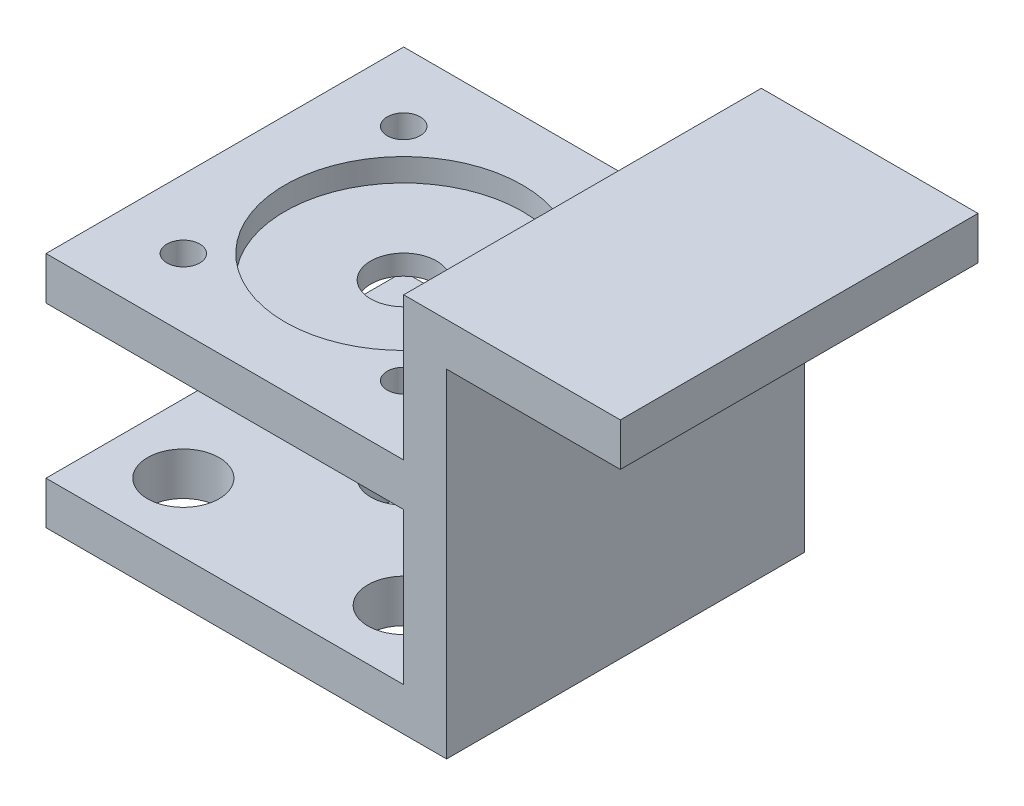
ISO-10303-21;
HEADER;
FILE_DESCRIPTION(('STEP AP214'),'2;1');
FILE_NAME('part.step','',(''),(''),'','','');
FILE_SCHEMA(('AUTOMOTIVE_DESIGN { 1 0 10303 214 1 1 1 1 }'));
ENDSEC;
DATA;
#1=APPLICATION_CONTEXT('core data for automotive mechanical design processes');
#2=APPLICATION_PROTOCOL_DEFINITION('international standard','automotive_design',2000,#1);
#3=PRODUCT_CONTEXT('',#1,'mechanical');
#4=PRODUCT('Part','Part','',(#3));
#5=PRODUCT_RELATED_PRODUCT_CATEGORY('part','',(#4));
#6=PRODUCT_DEFINITION_FORMATION('','',#4);
#7=PRODUCT_DEFINITION_CONTEXT('part definition',#1,'design');
#8=PRODUCT_DEFINITION('design','',#6,#7);
#9=PRODUCT_DEFINITION_SHAPE('','',#8);
#10=(LENGTH_UNIT() NAMED_UNIT(*) SI_UNIT(.MILLI.,.METRE.));
#11=(NAMED_UNIT(*) PLANE_ANGLE_UNIT() SI_UNIT($,.RADIAN.));
#12=(NAMED_UNIT(*) SI_UNIT($,.STERADIAN.) SOLID_ANGLE_UNIT());
#13=UNCERTAINTY_MEASURE_WITH_UNIT(LENGTH_MEASURE(1.E-05),#10,'distance_accuracy_value','');
#14=(GEOMETRIC_REPRESENTATION_CONTEXT(3) GLOBAL_UNCERTAINTY_ASSIGNED_CONTEXT((#13)) GLOBAL_UNIT_ASSIGNED_CONTEXT((#10,
#11,#12)) REPRESENTATION_CONTEXT('',''));
#15=CARTESIAN_POINT('',(0.,0.,0.));
#16=DIRECTION('',(0.,0.,1.));
#17=DIRECTION('',(1.,0.,0.));
#18=AXIS2_PLACEMENT_3D('',#15,#16,#17);
#19=CARTESIAN_POINT('',(0.,3.,0.));
#20=DIRECTION('',(0.,-1.,0.));
#21=DIRECTION('',(0.,0.,-1.));
#22=AXIS2_PLACEMENT_3D('',#19,#20,#21);
#23=PLANE('',#22);
#24=CARTESIAN_POINT('',(0.,3.,0.));
#25=DIRECTION('',(0.,1.,0.));
#26=DIRECTION('',(0.,0.,1.));
#27=AXIS2_PLACEMENT_3D('',#24,#25,#26);
#28=CIRCLE('',#27,8.3);
#29=CARTESIAN_POINT('',(0.,3.,8.3));
#30=VERTEX_POINT('',#29);
#31=EDGE_CURVE('E184',#30,#30,#28,.T.);
#32=ORIENTED_EDGE('',*,*,#31,.F.);
#33=EDGE_LOOP('',(#32));
#34=FACE_BOUND('',#33,.T.);
#35=CARTESIAN_POINT('',(7.7,3.,-7.7));
#36=DIRECTION('',(0.,1.,0.));
#37=DIRECTION('',(0.,0.,1.));
#38=AXIS2_PLACEMENT_3D('',#35,#36,#37);
#39=CIRCLE('',#38,1.15);
#40=CARTESIAN_POINT('',(7.7,3.,-6.55));
#41=VERTEX_POINT('',#40);
#42=EDGE_CURVE('E224',#41,#41,#39,.T.);
#43=ORIENTED_EDGE('',*,*,#42,.F.);
#44=EDGE_LOOP('',(#43));
#45=FACE_BOUND('',#44,.T.);
#46=CARTESIAN_POINT('',(7.7,3.,7.7));
#47=DIRECTION('',(0.,1.,0.));
#48=DIRECTION('',(0.,0.,1.));
#49=AXIS2_PLACEMENT_3D('',#46,#47,#48);
#50=CIRCLE('',#49,1.15);
#51=CARTESIAN_POINT('',(7.7,3.,8.85));
#52=VERTEX_POINT('',#51);
#53=EDGE_CURVE('E230',#52,#52,#50,.T.);
#54=ORIENTED_EDGE('',*,*,#53,.F.);
#55=EDGE_LOOP('',(#54));
#56=FACE_BOUND('',#55,.T.);
#57=CARTESIAN_POINT('',(-7.7,3.,7.7));
#58=DIRECTION('',(0.,1.,0.));
#59=DIRECTION('',(0.,0.,1.));
#60=AXIS2_PLACEMENT_3D('',#57,#58,#59);
#61=CIRCLE('',#60,1.15);
#62=CARTESIAN_POINT('',(-7.7,3.,8.85));
#63=VERTEX_POINT('',#62);
#64=EDGE_CURVE('E236',#63,#63,#61,.T.);
#65=ORIENTED_EDGE('',*,*,#64,.F.);
#66=EDGE_LOOP('',(#65));
#67=FACE_BOUND('',#66,.T.);
#68=CARTESIAN_POINT('',(-7.7,3.,-7.7));
#69=DIRECTION('',(0.,1.,0.));
#70=DIRECTION('',(0.,0.,1.));
#71=AXIS2_PLACEMENT_3D('',#68,#69,#70);
#72=CIRCLE('',#71,1.15);
#73=CARTESIAN_POINT('',(-7.7,3.,-6.55));
#74=VERTEX_POINT('',#73);
#75=EDGE_CURVE('E242',#74,#74,#72,.T.);
#76=ORIENTED_EDGE('',*,*,#75,.F.);
#77=EDGE_LOOP('',(#76));
#78=FACE_BOUND('',#77,.T.);
#79=DIRECTION('',(0.,0.,1.));
#80=VECTOR('',#79,1.);
#81=CARTESIAN_POINT('',(12.5,3.,-12.5));
#82=LINE('',#81,#80);
#83=CARTESIAN_POINT('',(12.5,3.,-12.5));
#84=VERTEX_POINT('',#83);
#85=CARTESIAN_POINT('',(12.5,3.,12.5));
#86=VERTEX_POINT('',#85);
#87=EDGE_CURVE('E62',#84,#86,#82,.T.);
#88=ORIENTED_EDGE('',*,*,#87,.F.);
#89=DIRECTION('',(-1.,0.,0.));
#90=VECTOR('',#89,1.);
#91=CARTESIAN_POINT('',(12.5,3.,-12.5));
#92=LINE('',#91,#90);
#93=CARTESIAN_POINT('',(-12.5,3.,-12.5));
#94=VERTEX_POINT('',#93);
#95=EDGE_CURVE('E254',#84,#94,#92,.T.);
#96=ORIENTED_EDGE('',*,*,#95,.T.);
#97=DIRECTION('',(0.,0.,1.));
#98=VECTOR('',#97,1.);
#99=CARTESIAN_POINT('',(-12.5,3.,-12.5));
#100=LINE('',#99,#98);
#101=CARTESIAN_POINT('',(-12.5,3.,12.5));
#102=VERTEX_POINT('',#101);
#103=EDGE_CURVE('E248',#94,#102,#100,.T.);
#104=ORIENTED_EDGE('',*,*,#103,.T.);
#105=DIRECTION('',(1.,0.,0.));
#106=VECTOR('',#105,1.);
#107=CARTESIAN_POINT('',(12.5,3.,12.5));
#108=LINE('',#107,#106);
#109=EDGE_CURVE('E251',#102,#86,#108,.T.);
#110=ORIENTED_EDGE('',*,*,#109,.T.);
#111=EDGE_LOOP('',(#88,#96,#104,#110));
#112=FACE_BOUND('',#111,.T.);
#113=ADVANCED_FACE('F39',(#34,#45,#56,#67,#78,#112),#23,.F.);
#114=CARTESIAN_POINT('',(0.,0.,0.));
#115=DIRECTION('',(0.,-1.,0.));
#116=DIRECTION('',(0.,0.,-1.));
#117=AXIS2_PLACEMENT_3D('',#114,#115,#116);
#118=PLANE('',#117);
#119=DIRECTION('',(0.,0.,-1.));
#120=VECTOR('',#119,1.);
#121=CARTESIAN_POINT('',(12.5,0.,12.5));
#122=LINE('',#121,#120);
#123=CARTESIAN_POINT('',(12.5,0.,12.5));
#124=VERTEX_POINT('',#123);
#125=CARTESIAN_POINT('',(12.5,0.,-12.5));
#126=VERTEX_POINT('',#125);
#127=EDGE_CURVE('E54',#124,#126,#122,.T.);
#128=ORIENTED_EDGE('',*,*,#127,.F.);
#129=DIRECTION('',(1.,0.,0.));
#130=VECTOR('',#129,1.);
#131=CARTESIAN_POINT('',(12.5,0.,12.5));
#132=LINE('',#131,#130);
#133=CARTESIAN_POINT('',(-12.5,0.,12.5));
#134=VERTEX_POINT('',#133);
#135=EDGE_CURVE('E259',#134,#124,#132,.T.);
#136=ORIENTED_EDGE('',*,*,#135,.F.);
#137=DIRECTION('',(0.,0.,1.));
#138=VECTOR('',#137,1.);
#139=CARTESIAN_POINT('',(-12.5,0.,-12.5));
#140=LINE('',#139,#138);
#141=CARTESIAN_POINT('',(-12.5,0.,-12.5));
#142=VERTEX_POINT('',#141);
#143=EDGE_CURVE('E245',#142,#134,#140,.T.);
#144=ORIENTED_EDGE('',*,*,#143,.F.);
#145=DIRECTION('',(-1.,0.,0.));
#146=VECTOR('',#145,1.);
#147=CARTESIAN_POINT('',(12.5,0.,-12.5));
#148=LINE('',#147,#146);
#149=EDGE_CURVE('E252',#126,#142,#148,.T.);
#150=ORIENTED_EDGE('',*,*,#149,.F.);
#151=EDGE_LOOP('',(#128,#136,#144,#150));
#152=FACE_BOUND('',#151,.T.);
#153=CARTESIAN_POINT('',(0.,0.,0.));
#154=DIRECTION('',(0.,1.,0.));
#155=DIRECTION('',(0.,0.,1.));
#156=AXIS2_PLACEMENT_3D('',#153,#154,#155);
#157=CIRCLE('',#156,2.3);
#158=CARTESIAN_POINT('',(0.,0.,2.3));
#159=VERTEX_POINT('',#158);
#160=EDGE_CURVE('E181',#159,#159,#157,.T.);
#161=ORIENTED_EDGE('',*,*,#160,.T.);
#162=EDGE_LOOP('',(#161));
#163=FACE_BOUND('',#162,.T.);
#164=CARTESIAN_POINT('',(7.7,0.,7.7));
#165=DIRECTION('',(0.,1.,0.));
#166=DIRECTION('',(0.,0.,1.));
#167=AXIS2_PLACEMENT_3D('',#164,#165,#166);
#168=CIRCLE('',#167,1.15);
#169=CARTESIAN_POINT('',(7.7,0.,8.85));
#170=VERTEX_POINT('',#169);
#171=EDGE_CURVE('E227',#170,#170,#168,.T.);
#172=ORIENTED_EDGE('',*,*,#171,.T.);
#173=EDGE_LOOP('',(#172));
#174=FACE_BOUND('',#173,.T.);
#175=CARTESIAN_POINT('',(-7.7,0.,-7.7));
#176=DIRECTION('',(0.,1.,0.));
#177=DIRECTION('',(0.,0.,1.));
#178=AXIS2_PLACEMENT_3D('',#175,#176,#177);
#179=CIRCLE('',#178,1.15);
#180=CARTESIAN_POINT('',(-7.7,0.,-6.55));
#181=VERTEX_POINT('',#180);
#182=EDGE_CURVE('E239',#181,#181,#179,.T.);
#183=ORIENTED_EDGE('',*,*,#182,.T.);
#184=EDGE_LOOP('',(#183));
#185=FACE_BOUND('',#184,.T.);
#186=CARTESIAN_POINT('',(-7.7,0.,7.7));
#187=DIRECTION('',(0.,1.,0.));
#188=DIRECTION('',(0.,0.,1.));
#189=AXIS2_PLACEMENT_3D('',#186,#187,#188);
#190=CIRCLE('',#189,1.15);
#191=CARTESIAN_POINT('',(-7.7,0.,8.85));
#192=VERTEX_POINT('',#191);
#193=EDGE_CURVE('E233',#192,#192,#190,.T.);
#194=ORIENTED_EDGE('',*,*,#193,.T.);
#195=EDGE_LOOP('',(#194));
#196=FACE_BOUND('',#195,.T.);
#197=CARTESIAN_POINT('',(7.7,0.,-7.7));
#198=DIRECTION('',(0.,1.,0.));
#199=DIRECTION('',(0.,0.,1.));
#200=AXIS2_PLACEMENT_3D('',#197,#198,#199);
#201=CIRCLE('',#200,1.15);
#202=CARTESIAN_POINT('',(7.7,0.,-6.55));
#203=VERTEX_POINT('',#202);
#204=EDGE_CURVE('E216',#203,#203,#201,.T.);
#205=ORIENTED_EDGE('',*,*,#204,.T.);
#206=EDGE_LOOP('',(#205));
#207=FACE_BOUND('',#206,.T.);
#208=ADVANCED_FACE('F299',(#152,#163,#174,#185,#196,#207),#118,.T.);
#209=CARTESIAN_POINT('',(-12.5,3.,-12.5));
#210=DIRECTION('',(1.,0.,0.));
#211=DIRECTION('',(0.,0.,-1.));
#212=AXIS2_PLACEMENT_3D('',#209,#210,#211);
#213=PLANE('',#212);
#214=ORIENTED_EDGE('',*,*,#143,.T.);
#215=DIRECTION('',(0.,-1.,0.));
#216=VECTOR('',#215,1.);
#217=CARTESIAN_POINT('',(-12.5,3.,12.5));
#218=LINE('',#217,#216);
#219=EDGE_CURVE('E12',#102,#134,#218,.T.);
#220=ORIENTED_EDGE('',*,*,#219,.F.);
#221=ORIENTED_EDGE('',*,*,#103,.F.);
#222=DIRECTION('',(0.,-1.,0.));
#223=VECTOR('',#222,1.);
#224=CARTESIAN_POINT('',(-12.5,3.,-12.5));
#225=LINE('',#224,#223);
#226=EDGE_CURVE('E256',#94,#142,#225,.T.);
#227=ORIENTED_EDGE('',*,*,#226,.T.);
#228=EDGE_LOOP('',(#214,#220,#221,#227));
#229=FACE_BOUND('',#228,.T.);
#230=ADVANCED_FACE('F41',(#229),#213,.F.);
#231=CARTESIAN_POINT('',(12.5,3.,12.5));
#232=DIRECTION('',(0.,0.,-1.));
#233=DIRECTION('',(-1.,0.,0.));
#234=AXIS2_PLACEMENT_3D('',#231,#232,#233);
#235=PLANE('',#234);
#236=ORIENTED_EDGE('',*,*,#135,.T.);
#237=DIRECTION('',(0.,1.,0.));
#238=VECTOR('',#237,1.);
#239=CARTESIAN_POINT('',(12.5,-10.6,12.5));
#240=LINE('',#239,#238);
#241=CARTESIAN_POINT('',(12.5,-10.6,12.5));
#242=VERTEX_POINT('',#241);
#243=EDGE_CURVE('E177',#242,#124,#240,.T.);
#244=ORIENTED_EDGE('',*,*,#243,.F.);
#245=DIRECTION('',(-1.,0.,0.));
#246=VECTOR('',#245,1.);
#247=CARTESIAN_POINT('',(15.5,-10.6,12.5));
#248=LINE('',#247,#246);
#249=CARTESIAN_POINT('',(-12.5,-10.6,12.5));
#250=VERTEX_POINT('',#249);
#251=EDGE_CURVE('E163',#242,#250,#248,.T.);
#252=ORIENTED_EDGE('',*,*,#251,.T.);
#253=DIRECTION('',(0.,1.,0.));
#254=VECTOR('',#253,1.);
#255=CARTESIAN_POINT('',(-12.5,-13.6,12.5));
#256=LINE('',#255,#254);
#257=CARTESIAN_POINT('',(-12.5,-13.6,12.5));
#258=VERTEX_POINT('',#257);
#259=EDGE_CURVE('E141',#258,#250,#256,.T.);
#260=ORIENTED_EDGE('',*,*,#259,.F.);
#261=DIRECTION('',(-1.,0.,0.));
#262=VECTOR('',#261,1.);
#263=CARTESIAN_POINT('',(15.5,-13.6,12.5));
#264=LINE('',#263,#262);
#265=CARTESIAN_POINT('',(15.5,-13.6,12.5));
#266=VERTEX_POINT('',#265);
#267=EDGE_CURVE('E138',#266,#258,#264,.T.);
#268=ORIENTED_EDGE('',*,*,#267,.F.);
#269=DIRECTION('',(0.,-1.,0.));
#270=VECTOR('',#269,1.);
#271=CARTESIAN_POINT('',(15.5,3.,12.5));
#272=LINE('',#271,#270);
#273=CARTESIAN_POINT('',(15.5,10.,12.5));
#274=VERTEX_POINT('',#273);
#275=EDGE_CURVE('E47',#274,#266,#272,.T.);
#276=ORIENTED_EDGE('',*,*,#275,.F.);
#277=DIRECTION('',(1.,0.,0.));
#278=VECTOR('',#277,1.);
#279=CARTESIAN_POINT('',(12.5,10.,12.5));
#280=LINE('',#279,#278);
#281=CARTESIAN_POINT('',(27.6439009661749,10.,12.5));
#282=VERTEX_POINT('',#281);
#283=EDGE_CURVE('E190',#274,#282,#280,.T.);
#284=ORIENTED_EDGE('',*,*,#283,.T.);
#285=DIRECTION('',(0.,-1.,0.));
#286=VECTOR('',#285,1.);
#287=CARTESIAN_POINT('',(27.6439009661749,13.,12.5));
#288=LINE('',#287,#286);
#289=CARTESIAN_POINT('',(27.6439009661749,13.,12.5));
#290=VERTEX_POINT('',#289);
#291=EDGE_CURVE('E212',#290,#282,#288,.T.);
#292=ORIENTED_EDGE('',*,*,#291,.F.);
#293=DIRECTION('',(1.,0.,0.));
#294=VECTOR('',#293,1.);
#295=CARTESIAN_POINT('',(12.5,13.,12.5));
#296=LINE('',#295,#294);
#297=CARTESIAN_POINT('',(12.5,13.,12.5));
#298=VERTEX_POINT('',#297);
#299=EDGE_CURVE('E196',#298,#290,#296,.T.);
#300=ORIENTED_EDGE('',*,*,#299,.F.);
#301=DIRECTION('',(0.,-1.,0.));
#302=VECTOR('',#301,1.);
#303=CARTESIAN_POINT('',(12.5,45.1793566240284,12.5));
#304=LINE('',#303,#302);
#305=EDGE_CURVE('E219',#298,#86,#304,.T.);
#306=ORIENTED_EDGE('',*,*,#305,.T.);
#307=ORIENTED_EDGE('',*,*,#109,.F.);
#308=ORIENTED_EDGE('',*,*,#219,.T.);
#309=EDGE_LOOP('',(#236,#244,#252,#260,#268,#276,#284,#292,#300,#306,#307,#308));
#310=FACE_BOUND('',#309,.T.);
#311=ADVANCED_FACE('F139',(#310),#235,.F.);
#312=CARTESIAN_POINT('',(15.5,3.,-12.5));
#313=DIRECTION('',(-1.,0.,0.));
#314=DIRECTION('',(0.,0.,1.));
#315=AXIS2_PLACEMENT_3D('',#312,#313,#314);
#316=PLANE('',#315);
#317=ORIENTED_EDGE('',*,*,#275,.T.);
#318=DIRECTION('',(0.,0.,1.));
#319=VECTOR('',#318,1.);
#320=CARTESIAN_POINT('',(15.5,-13.6,12.5));
#321=LINE('',#320,#319);
#322=CARTESIAN_POINT('',(15.5,-13.6,-12.5));
#323=VERTEX_POINT('',#322);
#324=EDGE_CURVE('E133',#323,#266,#321,.T.);
#325=ORIENTED_EDGE('',*,*,#324,.F.);
#326=DIRECTION('',(0.,-1.,0.));
#327=VECTOR('',#326,1.);
#328=CARTESIAN_POINT('',(15.5,3.,-12.5));
#329=LINE('',#328,#327);
#330=CARTESIAN_POINT('',(15.5,10.,-12.5));
#331=VERTEX_POINT('',#330);
#332=EDGE_CURVE('E136',#331,#323,#329,.T.);
#333=ORIENTED_EDGE('',*,*,#332,.F.);
#334=DIRECTION('',(0.,0.,1.));
#335=VECTOR('',#334,1.);
#336=CARTESIAN_POINT('',(15.5,10.,-12.5));
#337=LINE('',#336,#335);
#338=EDGE_CURVE('E134',#331,#274,#337,.T.);
#339=ORIENTED_EDGE('',*,*,#338,.T.);
#340=EDGE_LOOP('',(#317,#325,#333,#339));
#341=FACE_BOUND('',#340,.T.);
#342=ADVANCED_FACE('F130',(#341),#316,.F.);
#343=CARTESIAN_POINT('',(12.5,3.,-12.5));
#344=DIRECTION('',(0.,0.,1.));
#345=DIRECTION('',(1.,0.,0.));
#346=AXIS2_PLACEMENT_3D('',#343,#344,#345);
#347=PLANE('',#346);
#348=ORIENTED_EDGE('',*,*,#332,.T.);
#349=DIRECTION('',(1.,0.,0.));
#350=VECTOR('',#349,1.);
#351=CARTESIAN_POINT('',(15.5,-13.6,-12.5));
#352=LINE('',#351,#350);
#353=CARTESIAN_POINT('',(-12.5,-13.6,-12.5));
#354=VERTEX_POINT('',#353);
#355=EDGE_CURVE('E150',#354,#323,#352,.T.);
#356=ORIENTED_EDGE('',*,*,#355,.F.);
#357=DIRECTION('',(0.,1.,0.));
#358=VECTOR('',#357,1.);
#359=CARTESIAN_POINT('',(-12.5,-13.6,-12.5));
#360=LINE('',#359,#358);
#361=CARTESIAN_POINT('',(-12.5,-10.6,-12.5));
#362=VERTEX_POINT('',#361);
#363=EDGE_CURVE('E162',#354,#362,#360,.T.);
#364=ORIENTED_EDGE('',*,*,#363,.T.);
#365=DIRECTION('',(1.,0.,0.));
#366=VECTOR('',#365,1.);
#367=CARTESIAN_POINT('',(15.5,-10.6,-12.5));
#368=LINE('',#367,#366);
#369=CARTESIAN_POINT('',(12.5,-10.6,-12.5));
#370=VERTEX_POINT('',#369);
#371=EDGE_CURVE('E151',#362,#370,#368,.T.);
#372=ORIENTED_EDGE('',*,*,#371,.T.);
#373=DIRECTION('',(0.,1.,0.));
#374=VECTOR('',#373,1.);
#375=CARTESIAN_POINT('',(12.5,-10.6,-12.5));
#376=LINE('',#375,#374);
#377=EDGE_CURVE('E173',#370,#126,#376,.T.);
#378=ORIENTED_EDGE('',*,*,#377,.T.);
#379=ORIENTED_EDGE('',*,*,#149,.T.);
#380=ORIENTED_EDGE('',*,*,#226,.F.);
#381=ORIENTED_EDGE('',*,*,#95,.F.);
#382=DIRECTION('',(0.,-1.,0.));
#383=VECTOR('',#382,1.);
#384=CARTESIAN_POINT('',(12.5,45.1793566240284,-12.5));
#385=LINE('',#384,#383);
#386=CARTESIAN_POINT('',(12.5,13.,-12.5));
#387=VERTEX_POINT('',#386);
#388=EDGE_CURVE('E217',#387,#84,#385,.T.);
#389=ORIENTED_EDGE('',*,*,#388,.F.);
#390=DIRECTION('',(-1.,0.,0.));
#391=VECTOR('',#390,1.);
#392=CARTESIAN_POINT('',(12.5,13.,-12.5));
#393=LINE('',#392,#391);
#394=CARTESIAN_POINT('',(27.6439009661749,13.,-12.5));
#395=VERTEX_POINT('',#394);
#396=EDGE_CURVE('E201',#395,#387,#393,.T.);
#397=ORIENTED_EDGE('',*,*,#396,.F.);
#398=DIRECTION('',(0.,-1.,0.));
#399=VECTOR('',#398,1.);
#400=CARTESIAN_POINT('',(27.6439009661749,13.,-12.5));
#401=LINE('',#400,#399);
#402=CARTESIAN_POINT('',(27.6439009661749,10.,-12.5));
#403=VERTEX_POINT('',#402);
#404=EDGE_CURVE('E204',#395,#403,#401,.T.);
#405=ORIENTED_EDGE('',*,*,#404,.T.);
#406=DIRECTION('',(-1.,0.,0.));
#407=VECTOR('',#406,1.);
#408=CARTESIAN_POINT('',(12.5,10.,-12.5));
#409=LINE('',#408,#407);
#410=EDGE_CURVE('E197',#403,#331,#409,.T.);
#411=ORIENTED_EDGE('',*,*,#410,.T.);
#412=EDGE_LOOP('',(#348,#356,#364,#372,#378,#379,#380,#381,#389,#397,#405,#411));
#413=FACE_BOUND('',#412,.T.);
#414=ADVANCED_FACE('F265',(#413),#347,.F.);
#415=CARTESIAN_POINT('',(-7.7,3.,-7.7));
#416=DIRECTION('',(0.,-1.,0.));
#417=DIRECTION('',(0.,0.,-1.));
#418=AXIS2_PLACEMENT_3D('',#415,#416,#417);
#419=CYLINDRICAL_SURFACE('',#418,1.15);
#420=ORIENTED_EDGE('',*,*,#75,.T.);
#421=EDGE_LOOP('',(#420));
#422=FACE_BOUND('',#421,.T.);
#423=ORIENTED_EDGE('',*,*,#182,.F.);
#424=EDGE_LOOP('',(#423));
#425=FACE_BOUND('',#424,.T.);
#426=ADVANCED_FACE('F334',(#422,#425),#419,.F.);
#427=CARTESIAN_POINT('',(-7.7,3.,7.7));
#428=DIRECTION('',(0.,-1.,0.));
#429=DIRECTION('',(0.,0.,-1.));
#430=AXIS2_PLACEMENT_3D('',#427,#428,#429);
#431=CYLINDRICAL_SURFACE('',#430,1.15);
#432=ORIENTED_EDGE('',*,*,#64,.T.);
#433=EDGE_LOOP('',(#432));
#434=FACE_BOUND('',#433,.T.);
#435=ORIENTED_EDGE('',*,*,#193,.F.);
#436=EDGE_LOOP('',(#435));
#437=FACE_BOUND('',#436,.T.);
#438=ADVANCED_FACE('F323',(#434,#437),#431,.F.);
#439=CARTESIAN_POINT('',(7.7,3.,7.7));
#440=DIRECTION('',(0.,-1.,0.));
#441=DIRECTION('',(0.,0.,-1.));
#442=AXIS2_PLACEMENT_3D('',#439,#440,#441);
#443=CYLINDRICAL_SURFACE('',#442,1.15);
#444=ORIENTED_EDGE('',*,*,#53,.T.);
#445=EDGE_LOOP('',(#444));
#446=FACE_BOUND('',#445,.T.);
#447=ORIENTED_EDGE('',*,*,#171,.F.);
#448=EDGE_LOOP('',(#447));
#449=FACE_BOUND('',#448,.T.);
#450=ADVANCED_FACE('F315',(#446,#449),#443,.F.);
#451=CARTESIAN_POINT('',(7.7,3.,-7.7));
#452=DIRECTION('',(0.,-1.,0.));
#453=DIRECTION('',(0.,0.,-1.));
#454=AXIS2_PLACEMENT_3D('',#451,#452,#453);
#455=CYLINDRICAL_SURFACE('',#454,1.15);
#456=ORIENTED_EDGE('',*,*,#42,.T.);
#457=EDGE_LOOP('',(#456));
#458=FACE_BOUND('',#457,.T.);
#459=ORIENTED_EDGE('',*,*,#204,.F.);
#460=EDGE_LOOP('',(#459));
#461=FACE_BOUND('',#460,.T.);
#462=ADVANCED_FACE('F313',(#458,#461),#455,.F.);
#463=CARTESIAN_POINT('',(12.5,45.1793566240284,-12.5));
#464=DIRECTION('',(1.,0.,0.));
#465=DIRECTION('',(0.,0.,-1.));
#466=AXIS2_PLACEMENT_3D('',#463,#464,#465);
#467=PLANE('',#466);
#468=ORIENTED_EDGE('',*,*,#305,.F.);
#469=DIRECTION('',(0.,0.,1.));
#470=VECTOR('',#469,1.);
#471=CARTESIAN_POINT('',(12.5,13.,-12.5));
#472=LINE('',#471,#470);
#473=EDGE_CURVE('E193',#387,#298,#472,.T.);
#474=ORIENTED_EDGE('',*,*,#473,.F.);
#475=ORIENTED_EDGE('',*,*,#388,.T.);
#476=ORIENTED_EDGE('',*,*,#87,.T.);
#477=EDGE_LOOP('',(#468,#474,#475,#476));
#478=FACE_BOUND('',#477,.T.);
#479=ADVANCED_FACE('F281',(#478),#467,.F.);
#480=CARTESIAN_POINT('',(27.6439009661749,13.,-12.5));
#481=DIRECTION('',(-1.,0.,0.));
#482=DIRECTION('',(0.,0.,1.));
#483=AXIS2_PLACEMENT_3D('',#480,#481,#482);
#484=PLANE('',#483);
#485=DIRECTION('',(0.,0.,-1.));
#486=VECTOR('',#485,1.);
#487=CARTESIAN_POINT('',(27.6439009661749,10.,-12.5));
#488=LINE('',#487,#486);
#489=EDGE_CURVE('E206',#282,#403,#488,.T.);
#490=ORIENTED_EDGE('',*,*,#489,.T.);
#491=ORIENTED_EDGE('',*,*,#404,.F.);
#492=DIRECTION('',(0.,0.,-1.));
#493=VECTOR('',#492,1.);
#494=CARTESIAN_POINT('',(27.6439009661749,13.,-12.5));
#495=LINE('',#494,#493);
#496=EDGE_CURVE('E199',#290,#395,#495,.T.);
#497=ORIENTED_EDGE('',*,*,#496,.F.);
#498=ORIENTED_EDGE('',*,*,#291,.T.);
#499=EDGE_LOOP('',(#490,#491,#497,#498));
#500=FACE_BOUND('',#499,.T.);
#501=ADVANCED_FACE('F276',(#500),#484,.F.);
#502=CARTESIAN_POINT('',(0.,13.,0.));
#503=DIRECTION('',(0.,1.,0.));
#504=DIRECTION('',(0.,0.,1.));
#505=AXIS2_PLACEMENT_3D('',#502,#503,#504);
#506=PLANE('',#505);
#507=ORIENTED_EDGE('',*,*,#473,.T.);
#508=ORIENTED_EDGE('',*,*,#299,.T.);
#509=ORIENTED_EDGE('',*,*,#496,.T.);
#510=ORIENTED_EDGE('',*,*,#396,.T.);
#511=EDGE_LOOP('',(#507,#508,#509,#510));
#512=FACE_BOUND('',#511,.T.);
#513=ADVANCED_FACE('F278',(#512),#506,.T.);
#514=CARTESIAN_POINT('',(0.,10.,0.));
#515=DIRECTION('',(0.,1.,0.));
#516=DIRECTION('',(0.,0.,1.));
#517=AXIS2_PLACEMENT_3D('',#514,#515,#516);
#518=PLANE('',#517);
#519=ORIENTED_EDGE('',*,*,#338,.F.);
#520=ORIENTED_EDGE('',*,*,#410,.F.);
#521=ORIENTED_EDGE('',*,*,#489,.F.);
#522=ORIENTED_EDGE('',*,*,#283,.F.);
#523=EDGE_LOOP('',(#519,#520,#521,#522));
#524=FACE_BOUND('',#523,.T.);
#525=ADVANCED_FACE('F271',(#524),#518,.F.);
#526=CARTESIAN_POINT('',(0.,1.4,0.));
#527=DIRECTION('',(0.,1.,0.));
#528=DIRECTION('',(0.,0.,1.));
#529=AXIS2_PLACEMENT_3D('',#526,#527,#528);
#530=CYLINDRICAL_SURFACE('',#529,8.3);
#531=CARTESIAN_POINT('',(0.,1.4,0.));
#532=DIRECTION('',(0.,1.,0.));
#533=DIRECTION('',(0.,0.,1.));
#534=AXIS2_PLACEMENT_3D('',#531,#532,#533);
#535=CIRCLE('',#534,8.3);
#536=CARTESIAN_POINT('',(0.,1.4,8.3));
#537=VERTEX_POINT('',#536);
#538=EDGE_CURVE('E187',#537,#537,#535,.T.);
#539=ORIENTED_EDGE('',*,*,#538,.F.);
#540=EDGE_LOOP('',(#539));
#541=FACE_BOUND('',#540,.T.);
#542=ORIENTED_EDGE('',*,*,#31,.T.);
#543=EDGE_LOOP('',(#542));
#544=FACE_BOUND('',#543,.T.);
#545=ADVANCED_FACE('F495',(#541,#544),#530,.F.);
#546=CARTESIAN_POINT('',(0.,1.4,0.));
#547=DIRECTION('',(0.,1.,0.));
#548=DIRECTION('',(0.,0.,1.));
#549=AXIS2_PLACEMENT_3D('',#546,#547,#548);
#550=PLANE('',#549);
#551=CARTESIAN_POINT('',(0.,1.4,0.));
#552=DIRECTION('',(0.,1.,0.));
#553=DIRECTION('',(0.,0.,1.));
#554=AXIS2_PLACEMENT_3D('',#551,#552,#553);
#555=CIRCLE('',#554,2.3);
#556=CARTESIAN_POINT('',(0.,1.4,2.3));
#557=VERTEX_POINT('',#556);
#558=EDGE_CURVE('E180',#557,#557,#555,.T.);
#559=ORIENTED_EDGE('',*,*,#558,.F.);
#560=EDGE_LOOP('',(#559));
#561=FACE_BOUND('',#560,.T.);
#562=ORIENTED_EDGE('',*,*,#538,.T.);
#563=EDGE_LOOP('',(#562));
#564=FACE_BOUND('',#563,.T.);
#565=ADVANCED_FACE('F486',(#561,#564),#550,.T.);
#566=CARTESIAN_POINT('',(0.,0.,0.));
#567=DIRECTION('',(0.,1.,0.));
#568=DIRECTION('',(0.,0.,1.));
#569=AXIS2_PLACEMENT_3D('',#566,#567,#568);
#570=CYLINDRICAL_SURFACE('',#569,2.3);
#571=ORIENTED_EDGE('',*,*,#160,.F.);
#572=EDGE_LOOP('',(#571));
#573=FACE_BOUND('',#572,.T.);
#574=ORIENTED_EDGE('',*,*,#558,.T.);
#575=EDGE_LOOP('',(#574));
#576=FACE_BOUND('',#575,.T.);
#577=ADVANCED_FACE('F357',(#573,#576),#570,.F.);
#578=CARTESIAN_POINT('',(12.5,-10.6,12.5));
#579=DIRECTION('',(1.,0.,0.));
#580=DIRECTION('',(0.,0.,-1.));
#581=AXIS2_PLACEMENT_3D('',#578,#579,#580);
#582=PLANE('',#581);
#583=ORIENTED_EDGE('',*,*,#127,.T.);
#584=ORIENTED_EDGE('',*,*,#377,.F.);
#585=DIRECTION('',(0.,0.,-1.));
#586=VECTOR('',#585,1.);
#587=CARTESIAN_POINT('',(12.5,-10.6,12.5));
#588=LINE('',#587,#586);
#589=EDGE_CURVE('E170',#242,#370,#588,.T.);
#590=ORIENTED_EDGE('',*,*,#589,.F.);
#591=ORIENTED_EDGE('',*,*,#243,.T.);
#592=EDGE_LOOP('',(#583,#584,#590,#591));
#593=FACE_BOUND('',#592,.T.);
#594=ADVANCED_FACE('F289',(#593),#582,.F.);
#595=CARTESIAN_POINT('',(0.,-13.6,0.));
#596=DIRECTION('',(0.,1.,0.));
#597=DIRECTION('',(0.,0.,1.));
#598=AXIS2_PLACEMENT_3D('',#595,#596,#597);
#599=PLANE('',#598);
#600=ORIENTED_EDGE('',*,*,#324,.T.);
#601=ORIENTED_EDGE('',*,*,#267,.T.);
#602=DIRECTION('',(0.,0.,-1.));
#603=VECTOR('',#602,1.);
#604=CARTESIAN_POINT('',(-12.5,-13.6,12.5));
#605=LINE('',#604,#603);
#606=EDGE_CURVE('E144',#258,#354,#605,.T.);
#607=ORIENTED_EDGE('',*,*,#606,.T.);
#608=ORIENTED_EDGE('',*,*,#355,.T.);
#609=EDGE_LOOP('',(#600,#601,#607,#608));
#610=FACE_BOUND('',#609,.T.);
#611=CARTESIAN_POINT('',(0.,-13.6,0.));
#612=DIRECTION('',(0.,-1.,0.));
#613=DIRECTION('',(0.,0.,-1.));
#614=AXIS2_PLACEMENT_3D('',#611,#612,#613);
#615=CIRCLE('',#614,2.3);
#616=CARTESIAN_POINT('',(0.,-13.6,-2.3));
#617=VERTEX_POINT('',#616);
#618=EDGE_CURVE('E165',#617,#617,#615,.T.);
#619=ORIENTED_EDGE('',*,*,#618,.F.);
#620=EDGE_LOOP('',(#619));
#621=FACE_BOUND('',#620,.T.);
#622=CARTESIAN_POINT('',(-7.7,-13.6,7.7));
#623=DIRECTION('',(0.,-1.,0.));
#624=DIRECTION('',(0.,0.,-1.));
#625=AXIS2_PLACEMENT_3D('',#622,#623,#624);
#626=CIRCLE('',#625,2.5);
#627=CARTESIAN_POINT('',(-7.7,-13.6,5.2));
#628=VERTEX_POINT('',#627);
#629=EDGE_CURVE('E674',#628,#628,#626,.T.);
#630=ORIENTED_EDGE('',*,*,#629,.F.);
#631=EDGE_LOOP('',(#630));
#632=FACE_BOUND('',#631,.T.);
#633=CARTESIAN_POINT('',(-7.7,-13.6,-7.7));
#634=DIRECTION('',(0.,-1.,0.));
#635=DIRECTION('',(0.,0.,-1.));
#636=AXIS2_PLACEMENT_3D('',#633,#634,#635);
#637=CIRCLE('',#636,2.5);
#638=CARTESIAN_POINT('',(-7.7,-13.6,-10.2));
#639=VERTEX_POINT('',#638);
#640=EDGE_CURVE('E668',#639,#639,#637,.T.);
#641=ORIENTED_EDGE('',*,*,#640,.F.);
#642=EDGE_LOOP('',(#641));
#643=FACE_BOUND('',#642,.T.);
#644=CARTESIAN_POINT('',(7.7,-13.6,-7.7));
#645=DIRECTION('',(0.,-1.,0.));
#646=DIRECTION('',(0.,0.,-1.));
#647=AXIS2_PLACEMENT_3D('',#644,#645,#646);
#648=CIRCLE('',#647,2.5);
#649=CARTESIAN_POINT('',(7.7,-13.6,-10.2));
#650=VERTEX_POINT('',#649);
#651=EDGE_CURVE('E662',#650,#650,#648,.T.);
#652=ORIENTED_EDGE('',*,*,#651,.F.);
#653=EDGE_LOOP('',(#652));
#654=FACE_BOUND('',#653,.T.);
#655=CARTESIAN_POINT('',(7.7,-13.6,7.7));
#656=DIRECTION('',(0.,-1.,0.));
#657=DIRECTION('',(0.,0.,-1.));
#658=AXIS2_PLACEMENT_3D('',#655,#656,#657);
#659=CIRCLE('',#658,2.5);
#660=CARTESIAN_POINT('',(7.7,-13.6,5.2));
#661=VERTEX_POINT('',#660);
#662=EDGE_CURVE('E653',#661,#661,#659,.T.);
#663=ORIENTED_EDGE('',*,*,#662,.F.);
#664=EDGE_LOOP('',(#663));
#665=FACE_BOUND('',#664,.T.);
#666=ADVANCED_FACE('F147',(#610,#621,#632,#643,#654,#665),#599,.F.);
#667=CARTESIAN_POINT('',(0.,-10.6,0.));
#668=DIRECTION('',(0.,1.,0.));
#669=DIRECTION('',(0.,0.,1.));
#670=AXIS2_PLACEMENT_3D('',#667,#668,#669);
#671=PLANE('',#670);
#672=CARTESIAN_POINT('',(7.7,-10.6,-7.7));
#673=DIRECTION('',(0.,-1.,0.));
#674=DIRECTION('',(0.,0.,-1.));
#675=AXIS2_PLACEMENT_3D('',#672,#673,#674);
#676=CIRCLE('',#675,2.5);
#677=CARTESIAN_POINT('',(7.7,-10.6,-10.2));
#678=VERTEX_POINT('',#677);
#679=EDGE_CURVE('E659',#678,#678,#676,.T.);
#680=ORIENTED_EDGE('',*,*,#679,.T.);
#681=EDGE_LOOP('',(#680));
#682=FACE_BOUND('',#681,.T.);
#683=CARTESIAN_POINT('',(-7.7,-10.6,7.7));
#684=DIRECTION('',(0.,-1.,0.));
#685=DIRECTION('',(0.,0.,-1.));
#686=AXIS2_PLACEMENT_3D('',#683,#684,#685);
#687=CIRCLE('',#686,2.5);
#688=CARTESIAN_POINT('',(-7.7,-10.6,5.2));
#689=VERTEX_POINT('',#688);
#690=EDGE_CURVE('E671',#689,#689,#687,.T.);
#691=ORIENTED_EDGE('',*,*,#690,.T.);
#692=EDGE_LOOP('',(#691));
#693=FACE_BOUND('',#692,.T.);
#694=ORIENTED_EDGE('',*,*,#251,.F.);
#695=ORIENTED_EDGE('',*,*,#589,.T.);
#696=ORIENTED_EDGE('',*,*,#371,.F.);
#697=DIRECTION('',(0.,0.,-1.));
#698=VECTOR('',#697,1.);
#699=CARTESIAN_POINT('',(-12.5,-10.6,12.5));
#700=LINE('',#699,#698);
#701=EDGE_CURVE('E154',#250,#362,#700,.T.);
#702=ORIENTED_EDGE('',*,*,#701,.F.);
#703=EDGE_LOOP('',(#694,#695,#696,#702));
#704=FACE_BOUND('',#703,.T.);
#705=CARTESIAN_POINT('',(0.,-10.6,0.));
#706=DIRECTION('',(0.,-1.,0.));
#707=DIRECTION('',(0.,0.,-1.));
#708=AXIS2_PLACEMENT_3D('',#705,#706,#707);
#709=CIRCLE('',#708,2.3);
#710=CARTESIAN_POINT('',(0.,-10.6,-2.3));
#711=VERTEX_POINT('',#710);
#712=EDGE_CURVE('E157',#711,#711,#709,.T.);
#713=ORIENTED_EDGE('',*,*,#712,.T.);
#714=EDGE_LOOP('',(#713));
#715=FACE_BOUND('',#714,.T.);
#716=CARTESIAN_POINT('',(-7.7,-10.6,-7.7));
#717=DIRECTION('',(0.,-1.,0.));
#718=DIRECTION('',(0.,0.,-1.));
#719=AXIS2_PLACEMENT_3D('',#716,#717,#718);
#720=CIRCLE('',#719,2.5);
#721=CARTESIAN_POINT('',(-7.7,-10.6,-10.2));
#722=VERTEX_POINT('',#721);
#723=EDGE_CURVE('E665',#722,#722,#720,.T.);
#724=ORIENTED_EDGE('',*,*,#723,.T.);
#725=EDGE_LOOP('',(#724));
#726=FACE_BOUND('',#725,.T.);
#727=CARTESIAN_POINT('',(7.7,-10.6,7.7));
#728=DIRECTION('',(0.,-1.,0.));
#729=DIRECTION('',(0.,0.,-1.));
#730=AXIS2_PLACEMENT_3D('',#727,#728,#729);
#731=CIRCLE('',#730,2.5);
#732=CARTESIAN_POINT('',(7.7,-10.6,5.2));
#733=VERTEX_POINT('',#732);
#734=EDGE_CURVE('E656',#733,#733,#731,.T.);
#735=ORIENTED_EDGE('',*,*,#734,.T.);
#736=EDGE_LOOP('',(#735));
#737=FACE_BOUND('',#736,.T.);
#738=ADVANCED_FACE('F294',(#682,#693,#704,#715,#726,#737),#671,.T.);
#739=CARTESIAN_POINT('',(-12.5,-13.6,12.5));
#740=DIRECTION('',(1.,0.,0.));
#741=DIRECTION('',(0.,0.,-1.));
#742=AXIS2_PLACEMENT_3D('',#739,#740,#741);
#743=PLANE('',#742);
#744=ORIENTED_EDGE('',*,*,#701,.T.);
#745=ORIENTED_EDGE('',*,*,#363,.F.);
#746=ORIENTED_EDGE('',*,*,#606,.F.);
#747=ORIENTED_EDGE('',*,*,#259,.T.);
#748=EDGE_LOOP('',(#744,#745,#746,#747));
#749=FACE_BOUND('',#748,.T.);
#750=ADVANCED_FACE('F297',(#749),#743,.F.);
#751=CARTESIAN_POINT('',(0.,-13.6,0.));
#752=DIRECTION('',(0.,1.,0.));
#753=DIRECTION('',(0.,0.,1.));
#754=AXIS2_PLACEMENT_3D('',#751,#752,#753);
#755=CYLINDRICAL_SURFACE('',#754,2.3);
#756=ORIENTED_EDGE('',*,*,#618,.T.);
#757=EDGE_LOOP('',(#756));
#758=FACE_BOUND('',#757,.T.);
#759=ORIENTED_EDGE('',*,*,#712,.F.);
#760=EDGE_LOOP('',(#759));
#761=FACE_BOUND('',#760,.T.);
#762=ADVANCED_FACE('F415',(#758,#761),#755,.F.);
#763=CARTESIAN_POINT('',(-7.7,-13.6,7.7));
#764=DIRECTION('',(0.,1.,0.));
#765=DIRECTION('',(0.,0.,1.));
#766=AXIS2_PLACEMENT_3D('',#763,#764,#765);
#767=CYLINDRICAL_SURFACE('',#766,2.5);
#768=ORIENTED_EDGE('',*,*,#629,.T.);
#769=EDGE_LOOP('',(#768));
#770=FACE_BOUND('',#769,.T.);
#771=ORIENTED_EDGE('',*,*,#690,.F.);
#772=EDGE_LOOP('',(#771));
#773=FACE_BOUND('',#772,.T.);
#774=ADVANCED_FACE('F425',(#770,#773),#767,.F.);
#775=CARTESIAN_POINT('',(-7.7,-13.6,-7.7));
#776=DIRECTION('',(0.,1.,0.));
#777=DIRECTION('',(0.,0.,1.));
#778=AXIS2_PLACEMENT_3D('',#775,#776,#777);
#779=CYLINDRICAL_SURFACE('',#778,2.5);
#780=ORIENTED_EDGE('',*,*,#640,.T.);
#781=EDGE_LOOP('',(#780));
#782=FACE_BOUND('',#781,.T.);
#783=ORIENTED_EDGE('',*,*,#723,.F.);
#784=EDGE_LOOP('',(#783));
#785=FACE_BOUND('',#784,.T.);
#786=ADVANCED_FACE('F436',(#782,#785),#779,.F.);
#787=CARTESIAN_POINT('',(7.7,-13.6,-7.7));
#788=DIRECTION('',(0.,1.,0.));
#789=DIRECTION('',(0.,0.,1.));
#790=AXIS2_PLACEMENT_3D('',#787,#788,#789);
#791=CYLINDRICAL_SURFACE('',#790,2.5);
#792=ORIENTED_EDGE('',*,*,#651,.T.);
#793=EDGE_LOOP('',(#792));
#794=FACE_BOUND('',#793,.T.);
#795=ORIENTED_EDGE('',*,*,#679,.F.);
#796=EDGE_LOOP('',(#795));
#797=FACE_BOUND('',#796,.T.);
#798=ADVANCED_FACE('F447',(#794,#797),#791,.F.);
#799=CARTESIAN_POINT('',(7.7,-13.6,7.7));
#800=DIRECTION('',(0.,1.,0.));
#801=DIRECTION('',(0.,0.,1.));
#802=AXIS2_PLACEMENT_3D('',#799,#800,#801);
#803=CYLINDRICAL_SURFACE('',#802,2.5);
#804=ORIENTED_EDGE('',*,*,#662,.T.);
#805=EDGE_LOOP('',(#804));
#806=FACE_BOUND('',#805,.T.);
#807=ORIENTED_EDGE('',*,*,#734,.F.);
#808=EDGE_LOOP('',(#807));
#809=FACE_BOUND('',#808,.T.);
#810=ADVANCED_FACE('F458',(#806,#809),#803,.F.);
#811=CLOSED_SHELL('',(#113,#208,#230,#311,#342,#414,#426,#438,#450,#462,#479,#501,#513,#525,
#545,#565,#577,#594,#666,#738,#750,#762,#774,#786,#798,#810));
#812=MANIFOLD_SOLID_BREP('B2',#811);
#813=ADVANCED_BREP_SHAPE_REPRESENTATION('',(#18,#812),#14);
#814=SHAPE_DEFINITION_REPRESENTATION(#9,#813);
ENDSEC;
END-ISO-10303-21;
